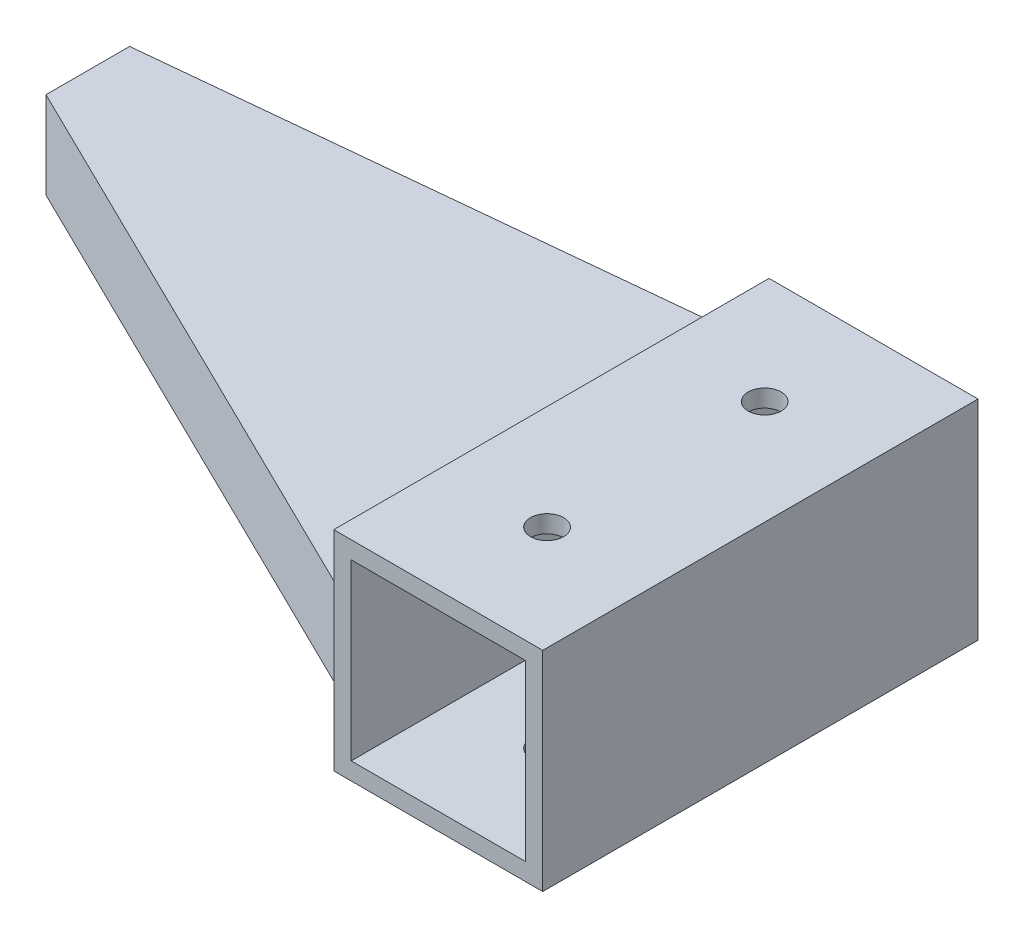
ISO-10303-21;
HEADER;
FILE_DESCRIPTION(('STEP AP214'),'2;1');
FILE_NAME('part.step','',(''),(''),'','','');
FILE_SCHEMA(('AUTOMOTIVE_DESIGN { 1 0 10303 214 1 1 1 1 }'));
ENDSEC;
DATA;
#1=APPLICATION_CONTEXT('core data for automotive mechanical design processes');
#2=APPLICATION_PROTOCOL_DEFINITION('international standard','automotive_design',2000,#1);
#3=PRODUCT_CONTEXT('',#1,'mechanical');
#4=PRODUCT('Part','Part','',(#3));
#5=PRODUCT_RELATED_PRODUCT_CATEGORY('part','',(#4));
#6=PRODUCT_DEFINITION_FORMATION('','',#4);
#7=PRODUCT_DEFINITION_CONTEXT('part definition',#1,'design');
#8=PRODUCT_DEFINITION('design','',#6,#7);
#9=PRODUCT_DEFINITION_SHAPE('','',#8);
#10=(LENGTH_UNIT() NAMED_UNIT(*) SI_UNIT(.MILLI.,.METRE.));
#11=(NAMED_UNIT(*) PLANE_ANGLE_UNIT() SI_UNIT($,.RADIAN.));
#12=(NAMED_UNIT(*) SI_UNIT($,.STERADIAN.) SOLID_ANGLE_UNIT());
#13=UNCERTAINTY_MEASURE_WITH_UNIT(LENGTH_MEASURE(1.E-05),#10,'distance_accuracy_value','');
#14=(GEOMETRIC_REPRESENTATION_CONTEXT(3) GLOBAL_UNCERTAINTY_ASSIGNED_CONTEXT((#13)) GLOBAL_UNIT_ASSIGNED_CONTEXT((#10,
#11,#12)) REPRESENTATION_CONTEXT('',''));
#15=CARTESIAN_POINT('',(0.,0.,0.));
#16=DIRECTION('',(0.,0.,1.));
#17=DIRECTION('',(1.,0.,0.));
#18=AXIS2_PLACEMENT_3D('',#15,#16,#17);
#19=CARTESIAN_POINT('',(-87.376,12.7,20.644));
#20=DIRECTION('',(1.,0.,0.));
#21=DIRECTION('',(0.,0.,-1.));
#22=AXIS2_PLACEMENT_3D('',#19,#20,#21);
#23=PLANE('',#22);
#24=CARTESIAN_POINT('',(-87.376,6.35,14.548));
#25=DIRECTION('',(-1.,0.,0.));
#26=DIRECTION('',(0.,0.,1.));
#27=AXIS2_PLACEMENT_3D('',#24,#25,#26);
#28=CIRCLE('',#27,3.556);
#29=CARTESIAN_POINT('',(-87.376,6.35,18.104));
#30=VERTEX_POINT('',#29);
#31=EDGE_CURVE('E152',#30,#30,#28,.T.);
#32=ORIENTED_EDGE('',*,*,#31,.F.);
#33=EDGE_LOOP('',(#32));
#34=FACE_BOUND('',#33,.T.);
#35=DIRECTION('',(0.,0.,1.));
#36=VECTOR('',#35,1.);
#37=CARTESIAN_POINT('',(-87.376,12.7,20.644));
#38=LINE('',#37,#36);
#39=CARTESIAN_POINT('',(-87.376,12.7,8.452));
#40=VERTEX_POINT('',#39);
#41=CARTESIAN_POINT('',(-87.376,12.7,20.644));
#42=VERTEX_POINT('',#41);
#43=EDGE_CURVE('E49',#40,#42,#38,.T.);
#44=ORIENTED_EDGE('',*,*,#43,.F.);
#45=DIRECTION('',(0.,1.,0.));
#46=VECTOR('',#45,1.);
#47=CARTESIAN_POINT('',(-87.376,-85.2559863000833,8.452));
#48=LINE('',#47,#46);
#49=CARTESIAN_POINT('',(-87.376,0.,8.452));
#50=VERTEX_POINT('',#49);
#51=EDGE_CURVE('E125',#50,#40,#48,.T.);
#52=ORIENTED_EDGE('',*,*,#51,.F.);
#53=DIRECTION('',(0.,0.,1.));
#54=VECTOR('',#53,1.);
#55=CARTESIAN_POINT('',(-87.376,0.,20.644));
#56=LINE('',#55,#54);
#57=CARTESIAN_POINT('',(-87.376,0.,20.644));
#58=VERTEX_POINT('',#57);
#59=EDGE_CURVE('E163',#50,#58,#56,.T.);
#60=ORIENTED_EDGE('',*,*,#59,.T.);
#61=DIRECTION('',(0.,-1.,0.));
#62=VECTOR('',#61,1.);
#63=CARTESIAN_POINT('',(-87.376,12.7,20.644));
#64=LINE('',#63,#62);
#65=EDGE_CURVE('E42',#42,#58,#64,.T.);
#66=ORIENTED_EDGE('',*,*,#65,.F.);
#67=EDGE_LOOP('',(#44,#52,#60,#66));
#68=FACE_BOUND('',#67,.T.);
#69=ADVANCED_FACE('F33',(#34,#68),#23,.F.);
#70=CARTESIAN_POINT('',(0.,12.7,63.5));
#71=DIRECTION('',(0.440361235129621,0.,-0.897820685100936));
#72=DIRECTION('',(-0.897820685100937,0.,-0.440361235129621));
#73=AXIS2_PLACEMENT_3D('',#70,#71,#72);
#74=PLANE('',#73);
#75=DIRECTION('',(0.897820685100936,0.,0.440361235129621));
#76=VECTOR('',#75,1.);
#77=CARTESIAN_POINT('',(0.,0.,63.5));
#78=LINE('',#77,#76);
#79=CARTESIAN_POINT('',(-2.54,0.,62.2541860465116));
#80=VERTEX_POINT('',#79);
#81=EDGE_CURVE('E166',#58,#80,#78,.T.);
#82=ORIENTED_EDGE('',*,*,#81,.T.);
#83=DIRECTION('',(0.,1.,0.));
#84=VECTOR('',#83,1.);
#85=CARTESIAN_POINT('',(-2.54,12.7,62.2541860465116));
#86=LINE('',#85,#84);
#87=CARTESIAN_POINT('',(-2.54,12.7,62.2541860465116));
#88=VERTEX_POINT('',#87);
#89=EDGE_CURVE('E153',#80,#88,#86,.T.);
#90=ORIENTED_EDGE('',*,*,#89,.T.);
#91=DIRECTION('',(0.897820685100936,0.,0.440361235129621));
#92=VECTOR('',#91,1.);
#93=CARTESIAN_POINT('',(0.,12.7,63.5));
#94=LINE('',#93,#92);
#95=EDGE_CURVE('E151',#42,#88,#94,.T.);
#96=ORIENTED_EDGE('',*,*,#95,.F.);
#97=ORIENTED_EDGE('',*,*,#65,.T.);
#98=EDGE_LOOP('',(#82,#90,#96,#97));
#99=FACE_BOUND('',#98,.T.);
#100=ADVANCED_FACE('F263',(#99),#74,.F.);
#101=CARTESIAN_POINT('',(0.,12.7,0.));
#102=DIRECTION('',(-1.,0.,0.));
#103=DIRECTION('',(0.,0.,1.));
#104=AXIS2_PLACEMENT_3D('',#101,#102,#103);
#105=PLANE('',#104);
#106=DIRECTION('',(0.,-1.,0.));
#107=VECTOR('',#106,1.);
#108=CARTESIAN_POINT('',(0.,12.7,63.5));
#109=LINE('',#108,#107);
#110=CARTESIAN_POINT('',(0.,19.05,63.5));
#111=VERTEX_POINT('',#110);
#112=CARTESIAN_POINT('',(0.,-6.35,63.5));
#113=VERTEX_POINT('',#112);
#114=EDGE_CURVE('E173',#111,#113,#109,.T.);
#115=ORIENTED_EDGE('',*,*,#114,.T.);
#116=DIRECTION('',(0.,0.,-1.));
#117=VECTOR('',#116,1.);
#118=CARTESIAN_POINT('',(0.,-6.35,63.5));
#119=LINE('',#118,#117);
#120=CARTESIAN_POINT('',(0.,-6.35,0.));
#121=VERTEX_POINT('',#120);
#122=EDGE_CURVE('E213',#113,#121,#119,.T.);
#123=ORIENTED_EDGE('',*,*,#122,.T.);
#124=DIRECTION('',(0.,-1.,0.));
#125=VECTOR('',#124,1.);
#126=CARTESIAN_POINT('',(0.,12.7,0.));
#127=LINE('',#126,#125);
#128=CARTESIAN_POINT('',(0.,19.05,0.));
#129=VERTEX_POINT('',#128);
#130=EDGE_CURVE('E168',#129,#121,#127,.T.);
#131=ORIENTED_EDGE('',*,*,#130,.F.);
#132=DIRECTION('',(0.,0.,-1.));
#133=VECTOR('',#132,1.);
#134=CARTESIAN_POINT('',(0.,19.05,63.5));
#135=LINE('',#134,#133);
#136=EDGE_CURVE('E205',#111,#129,#135,.T.);
#137=ORIENTED_EDGE('',*,*,#136,.F.);
#138=EDGE_LOOP('',(#115,#123,#131,#137));
#139=FACE_BOUND('',#138,.T.);
#140=ADVANCED_FACE('F302',(#139),#105,.F.);
#141=CARTESIAN_POINT('',(-87.376,12.7,0.));
#142=DIRECTION('',(0.,0.,1.));
#143=DIRECTION('',(1.,0.,0.));
#144=AXIS2_PLACEMENT_3D('',#141,#142,#143);
#145=PLANE('',#144);
#146=DIRECTION('',(0.,1.,0.));
#147=VECTOR('',#146,1.);
#148=CARTESIAN_POINT('',(-2.54,21.59,0.));
#149=LINE('',#148,#147);
#150=CARTESIAN_POINT('',(-2.54,-8.89,0.));
#151=VERTEX_POINT('',#150);
#152=CARTESIAN_POINT('',(-2.54,0.,0.));
#153=VERTEX_POINT('',#152);
#154=EDGE_CURVE('E139',#151,#153,#149,.T.);
#155=ORIENTED_EDGE('',*,*,#154,.T.);
#156=DIRECTION('',(0.,1.,0.));
#157=VECTOR('',#156,1.);
#158=CARTESIAN_POINT('',(-2.54,-85.2559863000833,0.));
#159=LINE('',#158,#157);
#160=CARTESIAN_POINT('',(-2.54,12.7,0.));
#161=VERTEX_POINT('',#160);
#162=EDGE_CURVE('E122',#153,#161,#159,.T.);
#163=ORIENTED_EDGE('',*,*,#162,.T.);
#164=CARTESIAN_POINT('',(-2.54,21.59,0.));
#165=VERTEX_POINT('',#164);
#166=EDGE_CURVE('E135',#161,#165,#149,.T.);
#167=ORIENTED_EDGE('',*,*,#166,.T.);
#168=DIRECTION('',(1.,0.,0.));
#169=VECTOR('',#168,1.);
#170=CARTESIAN_POINT('',(-2.54,21.59,0.));
#171=LINE('',#170,#169);
#172=CARTESIAN_POINT('',(27.94,21.59,0.));
#173=VERTEX_POINT('',#172);
#174=EDGE_CURVE('E227',#165,#173,#171,.T.);
#175=ORIENTED_EDGE('',*,*,#174,.T.);
#176=DIRECTION('',(0.,-1.,0.));
#177=VECTOR('',#176,1.);
#178=CARTESIAN_POINT('',(27.94,21.59,0.));
#179=LINE('',#178,#177);
#180=CARTESIAN_POINT('',(27.94,-8.89,0.));
#181=VERTEX_POINT('',#180);
#182=EDGE_CURVE('E216',#173,#181,#179,.T.);
#183=ORIENTED_EDGE('',*,*,#182,.T.);
#184=DIRECTION('',(-1.,0.,0.));
#185=VECTOR('',#184,1.);
#186=CARTESIAN_POINT('',(-2.54,-8.89,0.));
#187=LINE('',#186,#185);
#188=EDGE_CURVE('E148',#181,#151,#187,.T.);
#189=ORIENTED_EDGE('',*,*,#188,.T.);
#190=EDGE_LOOP('',(#155,#163,#167,#175,#183,#189));
#191=FACE_BOUND('',#190,.T.);
#192=DIRECTION('',(1.,0.,0.));
#193=VECTOR('',#192,1.);
#194=CARTESIAN_POINT('',(0.,19.05,0.));
#195=LINE('',#194,#193);
#196=CARTESIAN_POINT('',(25.4,19.05,0.));
#197=VERTEX_POINT('',#196);
#198=EDGE_CURVE('E183',#129,#197,#195,.T.);
#199=ORIENTED_EDGE('',*,*,#198,.F.);
#200=ORIENTED_EDGE('',*,*,#130,.T.);
#201=DIRECTION('',(-1.,0.,0.));
#202=VECTOR('',#201,1.);
#203=CARTESIAN_POINT('',(0.,-6.35,0.));
#204=LINE('',#203,#202);
#205=CARTESIAN_POINT('',(25.4,-6.35,0.));
#206=VERTEX_POINT('',#205);
#207=EDGE_CURVE('E199',#206,#121,#204,.T.);
#208=ORIENTED_EDGE('',*,*,#207,.F.);
#209=DIRECTION('',(0.,-1.,0.));
#210=VECTOR('',#209,1.);
#211=CARTESIAN_POINT('',(25.4,-6.35,0.));
#212=LINE('',#211,#210);
#213=EDGE_CURVE('E208',#197,#206,#212,.T.);
#214=ORIENTED_EDGE('',*,*,#213,.F.);
#215=EDGE_LOOP('',(#199,#200,#208,#214));
#216=FACE_BOUND('',#215,.T.);
#217=ADVANCED_FACE('F132',(#191,#216),#145,.F.);
#218=CARTESIAN_POINT('',(0.,12.7,0.));
#219=DIRECTION('',(0.,-1.,0.));
#220=DIRECTION('',(0.,0.,-1.));
#221=AXIS2_PLACEMENT_3D('',#218,#219,#220);
#222=PLANE('',#221);
#223=DIRECTION('',(0.,0.,-1.));
#224=VECTOR('',#223,1.);
#225=CARTESIAN_POINT('',(-2.54,12.7,0.));
#226=LINE('',#225,#224);
#227=EDGE_CURVE('E143',#88,#161,#226,.T.);
#228=ORIENTED_EDGE('',*,*,#227,.T.);
#229=DIRECTION('',(0.995073820404762,0.,-0.0991367335808035));
#230=VECTOR('',#229,1.);
#231=CARTESIAN_POINT('',(-87.376,12.7,8.452));
#232=LINE('',#231,#230);
#233=EDGE_CURVE('E119',#40,#161,#232,.T.);
#234=ORIENTED_EDGE('',*,*,#233,.F.);
#235=ORIENTED_EDGE('',*,*,#43,.T.);
#236=ORIENTED_EDGE('',*,*,#95,.T.);
#237=EDGE_LOOP('',(#228,#234,#235,#236));
#238=FACE_BOUND('',#237,.T.);
#239=ADVANCED_FACE('F150',(#238),#222,.F.);
#240=CARTESIAN_POINT('',(0.,0.,0.));
#241=DIRECTION('',(0.,-1.,0.));
#242=DIRECTION('',(0.,0.,-1.));
#243=AXIS2_PLACEMENT_3D('',#240,#241,#242);
#244=PLANE('',#243);
#245=DIRECTION('',(0.995073820404762,0.,-0.0991367335808035));
#246=VECTOR('',#245,1.);
#247=CARTESIAN_POINT('',(-87.376,0.,8.452));
#248=LINE('',#247,#246);
#249=EDGE_CURVE('E127',#50,#153,#248,.T.);
#250=ORIENTED_EDGE('',*,*,#249,.T.);
#251=DIRECTION('',(0.,0.,-1.));
#252=VECTOR('',#251,1.);
#253=CARTESIAN_POINT('',(-2.54,0.,0.));
#254=LINE('',#253,#252);
#255=EDGE_CURVE('E11',#80,#153,#254,.T.);
#256=ORIENTED_EDGE('',*,*,#255,.F.);
#257=ORIENTED_EDGE('',*,*,#81,.F.);
#258=ORIENTED_EDGE('',*,*,#59,.F.);
#259=EDGE_LOOP('',(#250,#256,#257,#258));
#260=FACE_BOUND('',#259,.T.);
#261=ADVANCED_FACE('F260',(#260),#244,.T.);
#262=CARTESIAN_POINT('',(-84.3788,6.35,14.548));
#263=DIRECTION('',(-1.,0.,0.));
#264=DIRECTION('',(0.,0.,1.));
#265=AXIS2_PLACEMENT_3D('',#262,#263,#264);
#266=CYLINDRICAL_SURFACE('',#265,3.556);
#267=CARTESIAN_POINT('',(-84.3788,6.35,14.548));
#268=DIRECTION('',(-1.,0.,0.));
#269=DIRECTION('',(0.,0.,1.));
#270=AXIS2_PLACEMENT_3D('',#267,#268,#269);
#271=CIRCLE('',#270,3.556);
#272=CARTESIAN_POINT('',(-84.3788,6.35,18.104));
#273=VERTEX_POINT('',#272);
#274=EDGE_CURVE('E156',#273,#273,#271,.T.);
#275=CARTESIAN_POINT('',(-84.3788,6.35,18.104));
#276=CARTESIAN_POINT('',(-84.4100208333333,6.35,18.104));
#277=CARTESIAN_POINT('',(-84.4412416666667,6.35,18.104));
#278=CARTESIAN_POINT('',(-84.5036833333333,6.35,18.104));
#279=CARTESIAN_POINT('',(-84.5349041666666,6.35,18.104));
#280=CARTESIAN_POINT('',(-84.5973458333333,6.35,18.104));
#281=CARTESIAN_POINT('',(-84.6285666666667,6.35,18.104));
#282=CARTESIAN_POINT('',(-84.6910083333333,6.35,18.104));
#283=CARTESIAN_POINT('',(-84.7222291666667,6.35,18.104));
#284=CARTESIAN_POINT('',(-84.7846708333333,6.35,18.104));
#285=CARTESIAN_POINT('',(-84.8158916666667,6.35,18.104));
#286=CARTESIAN_POINT('',(-84.8783333333333,6.35,18.104));
#287=CARTESIAN_POINT('',(-84.9095541666667,6.35,18.104));
#288=CARTESIAN_POINT('',(-84.9719958333333,6.35,18.104));
#289=CARTESIAN_POINT('',(-85.0032166666667,6.35,18.104));
#290=CARTESIAN_POINT('',(-85.0656583333333,6.35,18.104));
#291=CARTESIAN_POINT('',(-85.0968791666667,6.35,18.104));
#292=CARTESIAN_POINT('',(-85.1593208333333,6.35,18.104));
#293=CARTESIAN_POINT('',(-85.1905416666666,6.35,18.104));
#294=CARTESIAN_POINT('',(-85.2529833333333,6.35,18.104));
#295=CARTESIAN_POINT('',(-85.2842041666667,6.35,18.104));
#296=CARTESIAN_POINT('',(-85.3466458333333,6.35,18.104));
#297=CARTESIAN_POINT('',(-85.3778666666666,6.35,18.104));
#298=CARTESIAN_POINT('',(-85.4403083333333,6.35,18.104));
#299=CARTESIAN_POINT('',(-85.4715291666667,6.35,18.104));
#300=CARTESIAN_POINT('',(-85.5339708333333,6.35,18.104));
#301=CARTESIAN_POINT('',(-85.5651916666666,6.35,18.104));
#302=CARTESIAN_POINT('',(-85.6276333333333,6.35,18.104));
#303=CARTESIAN_POINT('',(-85.6588541666667,6.35,18.104));
#304=CARTESIAN_POINT('',(-85.7212958333333,6.35,18.104));
#305=CARTESIAN_POINT('',(-85.7525166666667,6.35,18.104));
#306=CARTESIAN_POINT('',(-85.8149583333333,6.35,18.104));
#307=CARTESIAN_POINT('',(-85.8461791666667,6.35,18.104));
#308=CARTESIAN_POINT('',(-85.9086208333333,6.35,18.104));
#309=CARTESIAN_POINT('',(-85.9398416666667,6.35,18.104));
#310=CARTESIAN_POINT('',(-86.0022833333333,6.35,18.104));
#311=CARTESIAN_POINT('',(-86.0335041666666,6.35,18.104));
#312=CARTESIAN_POINT('',(-86.0959458333333,6.35,18.104));
#313=CARTESIAN_POINT('',(-86.1271666666667,6.35,18.104));
#314=CARTESIAN_POINT('',(-86.1896083333333,6.35,18.104));
#315=CARTESIAN_POINT('',(-86.2208291666666,6.35,18.104));
#316=CARTESIAN_POINT('',(-86.2832708333333,6.35,18.104));
#317=CARTESIAN_POINT('',(-86.3144916666667,6.35,18.104));
#318=CARTESIAN_POINT('',(-86.3769333333333,6.35,18.104));
#319=CARTESIAN_POINT('',(-86.4081541666666,6.35,18.104));
#320=CARTESIAN_POINT('',(-86.4705958333333,6.35,18.104));
#321=CARTESIAN_POINT('',(-86.5018166666667,6.35,18.104));
#322=CARTESIAN_POINT('',(-86.5642583333333,6.35,18.104));
#323=CARTESIAN_POINT('',(-86.5954791666666,6.35,18.104));
#324=CARTESIAN_POINT('',(-86.6579208333333,6.35,18.104));
#325=CARTESIAN_POINT('',(-86.6891416666666,6.35,18.104));
#326=CARTESIAN_POINT('',(-86.7515833333333,6.35,18.104));
#327=CARTESIAN_POINT('',(-86.7828041666667,6.35,18.104));
#328=CARTESIAN_POINT('',(-86.8452458333333,6.35,18.104));
#329=CARTESIAN_POINT('',(-86.8764666666667,6.35,18.104));
#330=CARTESIAN_POINT('',(-86.9389083333333,6.35,18.104));
#331=CARTESIAN_POINT('',(-86.9701291666667,6.35,18.104));
#332=CARTESIAN_POINT('',(-87.0325708333333,6.35,18.104));
#333=CARTESIAN_POINT('',(-87.0637916666667,6.35,18.104));
#334=CARTESIAN_POINT('',(-87.1262333333333,6.35,18.104));
#335=CARTESIAN_POINT('',(-87.1574541666667,6.35,18.104));
#336=CARTESIAN_POINT('',(-87.2198958333333,6.35,18.104));
#337=CARTESIAN_POINT('',(-87.2511166666667,6.35,18.104));
#338=CARTESIAN_POINT('',(-87.3135583333333,6.35,18.104));
#339=CARTESIAN_POINT('',(-87.3447791666667,6.35,18.104));
#340=CARTESIAN_POINT('',(-87.376,6.35,18.104));
#341=B_SPLINE_CURVE_WITH_KNOTS('',3,(#275,#276,#277,#278,#279,#280,#281,#282,#283,#284,#285,
#286,#287,#288,#289,#290,#291,#292,#293,#294,#295,#296,#297,#298,#299,#300,#301,#302,#303,#304,
#305,#306,#307,#308,#309,#310,#311,#312,#313,#314,#315,#316,#317,#318,#319,#320,#321,#322,#323,
#324,#325,#326,#327,#328,#329,#330,#331,#332,#333,#334,#335,#336,#337,#338,#339,#340),
.UNSPECIFIED.,.F.,.F.,(4,2,2,2,2,2,2,2,2,2,2,2,2,2,2,2,2,2,2,2,2,2,2,2,2,2,2,2,2,2,2,2,4),(0.,
0.093662500000008,0.187325000000002,0.28098750000001,0.374650000000004,0.468312500000012,
0.561975000000006,0.655637500000014,0.749300000000008,0.842962500000002,0.93662500000001,
1.0302875,1.12395000000001,1.21761250000001,1.31127500000001,1.40493750000001,1.49860000000002,
1.59226250000001,1.685925,1.77958750000001,1.87325000000001,1.96691250000001,2.06057500000001,
2.15423750000002,2.24790000000001,2.34156250000001,2.43522500000001,2.52888750000001,
2.62255000000002,2.71621250000001,2.80987500000002,2.90353750000001,2.99720000000002),.UNSPECIFIED.);
#342=EDGE_CURVE('BSEAM305',#273,#30,#341,.T.);
#343=ORIENTED_EDGE('',*,*,#274,.F.);
#344=ORIENTED_EDGE('',*,*,#31,.T.);
#345=ORIENTED_EDGE('',*,*,#342,.T.);
#346=ORIENTED_EDGE('',*,*,#342,.F.);
#347=EDGE_LOOP('',(#343,#345,#344,#346));
#348=FACE_BOUND('',#347,.T.);
#349=ADVANCED_FACE('F305',(#348),#266,.F.);
#350=CARTESIAN_POINT('',(-84.3788,6.35,14.548));
#351=DIRECTION('',(-1.,0.,0.));
#352=DIRECTION('',(0.,0.,1.));
#353=AXIS2_PLACEMENT_3D('',#350,#351,#352);
#354=PLANE('',#353);
#355=ORIENTED_EDGE('',*,*,#274,.T.);
#356=EDGE_LOOP('',(#355));
#357=FACE_BOUND('',#356,.T.);
#358=ADVANCED_FACE('F307',(#357),#354,.T.);
#359=CARTESIAN_POINT('',(-2.54,21.59,63.5));
#360=DIRECTION('',(-1.,0.,0.));
#361=DIRECTION('',(0.,0.,1.));
#362=AXIS2_PLACEMENT_3D('',#359,#360,#361);
#363=PLANE('',#362);
#364=ORIENTED_EDGE('',*,*,#227,.F.);
#365=ORIENTED_EDGE('',*,*,#89,.F.);
#366=ORIENTED_EDGE('',*,*,#255,.T.);
#367=ORIENTED_EDGE('',*,*,#154,.F.);
#368=DIRECTION('',(0.,0.,-1.));
#369=VECTOR('',#368,1.);
#370=CARTESIAN_POINT('',(-2.54,-8.89,63.5));
#371=LINE('',#370,#369);
#372=CARTESIAN_POINT('',(-2.54,-8.89,63.5));
#373=VERTEX_POINT('',#372);
#374=EDGE_CURVE('E242',#373,#151,#371,.T.);
#375=ORIENTED_EDGE('',*,*,#374,.F.);
#376=DIRECTION('',(0.,1.,0.));
#377=VECTOR('',#376,1.);
#378=CARTESIAN_POINT('',(-2.54,21.59,63.5));
#379=LINE('',#378,#377);
#380=CARTESIAN_POINT('',(-2.54,21.59,63.5));
#381=VERTEX_POINT('',#380);
#382=EDGE_CURVE('E230',#373,#381,#379,.T.);
#383=ORIENTED_EDGE('',*,*,#382,.T.);
#384=DIRECTION('',(0.,0.,-1.));
#385=VECTOR('',#384,1.);
#386=CARTESIAN_POINT('',(-2.54,21.59,63.5));
#387=LINE('',#386,#385);
#388=EDGE_CURVE('E146',#381,#165,#387,.T.);
#389=ORIENTED_EDGE('',*,*,#388,.T.);
#390=ORIENTED_EDGE('',*,*,#166,.F.);
#391=EDGE_LOOP('',(#364,#365,#366,#367,#375,#383,#389,#390));
#392=FACE_BOUND('',#391,.T.);
#393=ADVANCED_FACE('F142',(#392),#363,.T.);
#394=CARTESIAN_POINT('',(27.94,21.59,63.5));
#395=DIRECTION('',(1.,0.,0.));
#396=DIRECTION('',(0.,0.,-1.));
#397=AXIS2_PLACEMENT_3D('',#394,#395,#396);
#398=PLANE('',#397);
#399=ORIENTED_EDGE('',*,*,#182,.F.);
#400=DIRECTION('',(0.,0.,-1.));
#401=VECTOR('',#400,1.);
#402=CARTESIAN_POINT('',(27.94,21.59,63.5));
#403=LINE('',#402,#401);
#404=CARTESIAN_POINT('',(27.94,21.59,63.5));
#405=VERTEX_POINT('',#404);
#406=EDGE_CURVE('E158',#405,#173,#403,.T.);
#407=ORIENTED_EDGE('',*,*,#406,.F.);
#408=DIRECTION('',(0.,-1.,0.));
#409=VECTOR('',#408,1.);
#410=CARTESIAN_POINT('',(27.94,21.59,63.5));
#411=LINE('',#410,#409);
#412=CARTESIAN_POINT('',(27.94,-8.89,63.5));
#413=VERTEX_POINT('',#412);
#414=EDGE_CURVE('E223',#405,#413,#411,.T.);
#415=ORIENTED_EDGE('',*,*,#414,.T.);
#416=DIRECTION('',(0.,0.,-1.));
#417=VECTOR('',#416,1.);
#418=CARTESIAN_POINT('',(27.94,-8.89,63.5));
#419=LINE('',#418,#417);
#420=EDGE_CURVE('E235',#413,#181,#419,.T.);
#421=ORIENTED_EDGE('',*,*,#420,.T.);
#422=EDGE_LOOP('',(#399,#407,#415,#421));
#423=FACE_BOUND('',#422,.T.);
#424=ADVANCED_FACE('F246',(#423),#398,.T.);
#425=CARTESIAN_POINT('',(-2.54,21.59,63.5));
#426=DIRECTION('',(0.,1.,0.));
#427=DIRECTION('',(0.,0.,1.));
#428=AXIS2_PLACEMENT_3D('',#425,#426,#427);
#429=PLANE('',#428);
#430=CARTESIAN_POINT('',(12.7,21.59,47.625));
#431=DIRECTION('',(0.,1.,0.));
#432=DIRECTION('',(0.,0.,1.));
#433=AXIS2_PLACEMENT_3D('',#430,#431,#432);
#434=CIRCLE('',#433,2.413);
#435=CARTESIAN_POINT('',(12.7,21.59,50.038));
#436=VERTEX_POINT('',#435);
#437=EDGE_CURVE('E266',#436,#436,#434,.T.);
#438=ORIENTED_EDGE('',*,*,#437,.F.);
#439=EDGE_LOOP('',(#438));
#440=FACE_BOUND('',#439,.T.);
#441=CARTESIAN_POINT('',(12.7,21.59,15.875));
#442=DIRECTION('',(0.,1.,0.));
#443=DIRECTION('',(0.,0.,1.));
#444=AXIS2_PLACEMENT_3D('',#441,#442,#443);
#445=CIRCLE('',#444,2.413);
#446=CARTESIAN_POINT('',(12.7,21.59,18.288));
#447=VERTEX_POINT('',#446);
#448=EDGE_CURVE('E186',#447,#447,#445,.T.);
#449=ORIENTED_EDGE('',*,*,#448,.F.);
#450=EDGE_LOOP('',(#449));
#451=FACE_BOUND('',#450,.T.);
#452=ORIENTED_EDGE('',*,*,#174,.F.);
#453=ORIENTED_EDGE('',*,*,#388,.F.);
#454=DIRECTION('',(1.,0.,0.));
#455=VECTOR('',#454,1.);
#456=CARTESIAN_POINT('',(-2.54,21.59,63.5));
#457=LINE('',#456,#455);
#458=EDGE_CURVE('E232',#381,#405,#457,.T.);
#459=ORIENTED_EDGE('',*,*,#458,.T.);
#460=ORIENTED_EDGE('',*,*,#406,.T.);
#461=EDGE_LOOP('',(#452,#453,#459,#460));
#462=FACE_BOUND('',#461,.T.);
#463=ADVANCED_FACE('F252',(#440,#451,#462),#429,.T.);
#464=CARTESIAN_POINT('',(-2.54,-8.89,63.5));
#465=DIRECTION('',(0.,-1.,0.));
#466=DIRECTION('',(0.,0.,-1.));
#467=AXIS2_PLACEMENT_3D('',#464,#465,#466);
#468=PLANE('',#467);
#469=CARTESIAN_POINT('',(12.7,-8.89,47.625));
#470=DIRECTION('',(0.,-1.,0.));
#471=DIRECTION('',(0.,0.,-1.));
#472=AXIS2_PLACEMENT_3D('',#469,#470,#471);
#473=CIRCLE('',#472,2.413);
#474=CARTESIAN_POINT('',(12.7,-8.89,45.212));
#475=VERTEX_POINT('',#474);
#476=EDGE_CURVE('E269',#475,#475,#473,.F.);
#477=ORIENTED_EDGE('',*,*,#476,.T.);
#478=EDGE_LOOP('',(#477));
#479=FACE_BOUND('',#478,.T.);
#480=CARTESIAN_POINT('',(12.7,-8.89,15.875));
#481=DIRECTION('',(0.,-1.,0.));
#482=DIRECTION('',(0.,0.,-1.));
#483=AXIS2_PLACEMENT_3D('',#480,#481,#482);
#484=CIRCLE('',#483,2.413);
#485=CARTESIAN_POINT('',(12.7,-8.89,13.462));
#486=VERTEX_POINT('',#485);
#487=EDGE_CURVE('E179',#486,#486,#484,.F.);
#488=ORIENTED_EDGE('',*,*,#487,.T.);
#489=EDGE_LOOP('',(#488));
#490=FACE_BOUND('',#489,.T.);
#491=ORIENTED_EDGE('',*,*,#188,.F.);
#492=ORIENTED_EDGE('',*,*,#420,.F.);
#493=DIRECTION('',(-1.,0.,0.));
#494=VECTOR('',#493,1.);
#495=CARTESIAN_POINT('',(-2.54,-8.89,63.5));
#496=LINE('',#495,#494);
#497=EDGE_CURVE('E226',#413,#373,#496,.T.);
#498=ORIENTED_EDGE('',*,*,#497,.T.);
#499=ORIENTED_EDGE('',*,*,#374,.T.);
#500=EDGE_LOOP('',(#491,#492,#498,#499));
#501=FACE_BOUND('',#500,.T.);
#502=ADVANCED_FACE('F250',(#479,#490,#501),#468,.T.);
#503=CARTESIAN_POINT('',(0.,0.,63.5));
#504=DIRECTION('',(0.,0.,1.));
#505=DIRECTION('',(1.,0.,0.));
#506=AXIS2_PLACEMENT_3D('',#503,#504,#505);
#507=PLANE('',#506);
#508=DIRECTION('',(-1.,0.,0.));
#509=VECTOR('',#508,1.);
#510=CARTESIAN_POINT('',(0.,-6.35,63.5));
#511=LINE('',#510,#509);
#512=CARTESIAN_POINT('',(25.4,-6.35,63.5));
#513=VERTEX_POINT('',#512);
#514=EDGE_CURVE('E202',#513,#113,#511,.T.);
#515=ORIENTED_EDGE('',*,*,#514,.T.);
#516=ORIENTED_EDGE('',*,*,#114,.F.);
#517=DIRECTION('',(1.,0.,0.));
#518=VECTOR('',#517,1.);
#519=CARTESIAN_POINT('',(0.,19.05,63.5));
#520=LINE('',#519,#518);
#521=CARTESIAN_POINT('',(25.4,19.05,63.5));
#522=VERTEX_POINT('',#521);
#523=EDGE_CURVE('E195',#111,#522,#520,.T.);
#524=ORIENTED_EDGE('',*,*,#523,.T.);
#525=DIRECTION('',(0.,-1.,0.));
#526=VECTOR('',#525,1.);
#527=CARTESIAN_POINT('',(25.4,-6.35,63.5));
#528=LINE('',#527,#526);
#529=EDGE_CURVE('E198',#522,#513,#528,.T.);
#530=ORIENTED_EDGE('',*,*,#529,.T.);
#531=EDGE_LOOP('',(#515,#516,#524,#530));
#532=FACE_BOUND('',#531,.T.);
#533=ORIENTED_EDGE('',*,*,#414,.F.);
#534=ORIENTED_EDGE('',*,*,#458,.F.);
#535=ORIENTED_EDGE('',*,*,#382,.F.);
#536=ORIENTED_EDGE('',*,*,#497,.F.);
#537=EDGE_LOOP('',(#533,#534,#535,#536));
#538=FACE_BOUND('',#537,.T.);
#539=ADVANCED_FACE('F255',(#532,#538),#507,.T.);
#540=CARTESIAN_POINT('',(0.,-6.35,63.5));
#541=DIRECTION('',(0.,-1.,0.));
#542=DIRECTION('',(1.,0.,0.));
#543=AXIS2_PLACEMENT_3D('',#540,#541,#542);
#544=PLANE('',#543);
#545=CARTESIAN_POINT('',(12.7,-6.35,47.625));
#546=DIRECTION('',(0.,-1.,0.));
#547=DIRECTION('',(1.,0.,0.));
#548=AXIS2_PLACEMENT_3D('',#545,#546,#547);
#549=CIRCLE('',#548,2.413);
#550=CARTESIAN_POINT('',(15.113,-6.35,47.625));
#551=VERTEX_POINT('',#550);
#552=EDGE_CURVE('E191',#551,#551,#549,.T.);
#553=ORIENTED_EDGE('',*,*,#552,.T.);
#554=EDGE_LOOP('',(#553));
#555=FACE_BOUND('',#554,.T.);
#556=CARTESIAN_POINT('',(12.7,-6.35,15.875));
#557=DIRECTION('',(0.,-1.,0.));
#558=DIRECTION('',(1.,0.,0.));
#559=AXIS2_PLACEMENT_3D('',#556,#557,#558);
#560=CIRCLE('',#559,2.413);
#561=CARTESIAN_POINT('',(15.113,-6.35,15.875));
#562=VERTEX_POINT('',#561);
#563=EDGE_CURVE('E178',#562,#562,#560,.T.);
#564=ORIENTED_EDGE('',*,*,#563,.T.);
#565=EDGE_LOOP('',(#564));
#566=FACE_BOUND('',#565,.T.);
#567=ORIENTED_EDGE('',*,*,#207,.T.);
#568=ORIENTED_EDGE('',*,*,#122,.F.);
#569=ORIENTED_EDGE('',*,*,#514,.F.);
#570=DIRECTION('',(0.,0.,-1.));
#571=VECTOR('',#570,1.);
#572=CARTESIAN_POINT('',(25.4,-6.35,63.5));
#573=LINE('',#572,#571);
#574=EDGE_CURVE('E217',#513,#206,#573,.T.);
#575=ORIENTED_EDGE('',*,*,#574,.T.);
#576=EDGE_LOOP('',(#567,#568,#569,#575));
#577=FACE_BOUND('',#576,.T.);
#578=ADVANCED_FACE('F334',(#555,#566,#577),#544,.F.);
#579=CARTESIAN_POINT('',(25.4,-6.35,63.5));
#580=DIRECTION('',(1.,0.,0.));
#581=DIRECTION('',(0.,0.,-1.));
#582=AXIS2_PLACEMENT_3D('',#579,#580,#581);
#583=PLANE('',#582);
#584=ORIENTED_EDGE('',*,*,#213,.T.);
#585=ORIENTED_EDGE('',*,*,#574,.F.);
#586=ORIENTED_EDGE('',*,*,#529,.F.);
#587=DIRECTION('',(0.,0.,-1.));
#588=VECTOR('',#587,1.);
#589=CARTESIAN_POINT('',(25.4,19.05,63.5));
#590=LINE('',#589,#588);
#591=EDGE_CURVE('E219',#522,#197,#590,.T.);
#592=ORIENTED_EDGE('',*,*,#591,.T.);
#593=EDGE_LOOP('',(#584,#585,#586,#592));
#594=FACE_BOUND('',#593,.T.);
#595=ADVANCED_FACE('F338',(#594),#583,.F.);
#596=CARTESIAN_POINT('',(0.,19.05,63.5));
#597=DIRECTION('',(0.,1.,0.));
#598=DIRECTION('',(-1.,0.,0.));
#599=AXIS2_PLACEMENT_3D('',#596,#597,#598);
#600=PLANE('',#599);
#601=CARTESIAN_POINT('',(12.7,19.05,47.625));
#602=DIRECTION('',(0.,1.,0.));
#603=DIRECTION('',(-1.,0.,0.));
#604=AXIS2_PLACEMENT_3D('',#601,#602,#603);
#605=CIRCLE('',#604,2.413);
#606=CARTESIAN_POINT('',(10.287,19.05,47.625));
#607=VERTEX_POINT('',#606);
#608=EDGE_CURVE('E36',#607,#607,#605,.T.);
#609=ORIENTED_EDGE('',*,*,#608,.T.);
#610=EDGE_LOOP('',(#609));
#611=FACE_BOUND('',#610,.T.);
#612=CARTESIAN_POINT('',(12.7,19.05,15.875));
#613=DIRECTION('',(0.,1.,0.));
#614=DIRECTION('',(-1.,0.,0.));
#615=AXIS2_PLACEMENT_3D('',#612,#613,#614);
#616=CIRCLE('',#615,2.413);
#617=CARTESIAN_POINT('',(10.287,19.05,15.875));
#618=VERTEX_POINT('',#617);
#619=EDGE_CURVE('E176',#618,#618,#616,.T.);
#620=ORIENTED_EDGE('',*,*,#619,.T.);
#621=EDGE_LOOP('',(#620));
#622=FACE_BOUND('',#621,.T.);
#623=ORIENTED_EDGE('',*,*,#198,.T.);
#624=ORIENTED_EDGE('',*,*,#591,.F.);
#625=ORIENTED_EDGE('',*,*,#523,.F.);
#626=ORIENTED_EDGE('',*,*,#136,.T.);
#627=EDGE_LOOP('',(#623,#624,#625,#626));
#628=FACE_BOUND('',#627,.T.);
#629=ADVANCED_FACE('F280',(#611,#622,#628),#600,.F.);
#630=CARTESIAN_POINT('',(12.7,-15.7149946520126,15.875));
#631=DIRECTION('',(0.,1.,0.));
#632=DIRECTION('',(0.,0.,1.));
#633=AXIS2_PLACEMENT_3D('',#630,#631,#632);
#634=CYLINDRICAL_SURFACE('',#633,2.413);
#635=ORIENTED_EDGE('',*,*,#448,.T.);
#636=EDGE_LOOP('',(#635));
#637=FACE_BOUND('',#636,.T.);
#638=ORIENTED_EDGE('',*,*,#619,.F.);
#639=EDGE_LOOP('',(#638));
#640=FACE_BOUND('',#639,.T.);
#641=ADVANCED_FACE('F293',(#637,#640),#634,.F.);
#642=ORIENTED_EDGE('',*,*,#487,.F.);
#643=EDGE_LOOP('',(#642));
#644=FACE_BOUND('',#643,.T.);
#645=ORIENTED_EDGE('',*,*,#563,.F.);
#646=EDGE_LOOP('',(#645));
#647=FACE_BOUND('',#646,.T.);
#648=ADVANCED_FACE('F285',(#644,#647),#634,.F.);
#649=CARTESIAN_POINT('',(12.7,-15.7149946520126,47.625));
#650=DIRECTION('',(0.,1.,0.));
#651=DIRECTION('',(0.,0.,1.));
#652=AXIS2_PLACEMENT_3D('',#649,#650,#651);
#653=CYLINDRICAL_SURFACE('',#652,2.413);
#654=ORIENTED_EDGE('',*,*,#437,.T.);
#655=EDGE_LOOP('',(#654));
#656=FACE_BOUND('',#655,.T.);
#657=ORIENTED_EDGE('',*,*,#608,.F.);
#658=EDGE_LOOP('',(#657));
#659=FACE_BOUND('',#658,.T.);
#660=ADVANCED_FACE('F282',(#656,#659),#653,.F.);
#661=ORIENTED_EDGE('',*,*,#476,.F.);
#662=EDGE_LOOP('',(#661));
#663=FACE_BOUND('',#662,.T.);
#664=ORIENTED_EDGE('',*,*,#552,.F.);
#665=EDGE_LOOP('',(#664));
#666=FACE_BOUND('',#665,.T.);
#667=ADVANCED_FACE('F284',(#663,#666),#653,.F.);
#668=CARTESIAN_POINT('',(-87.376,-85.2559863000833,8.452));
#669=DIRECTION('',(0.0991367335808035,0.,0.995073820404762));
#670=DIRECTION('',(0.995073820404762,0.,-0.0991367335808035));
#671=AXIS2_PLACEMENT_3D('',#668,#669,#670);
#672=PLANE('',#671);
#673=ORIENTED_EDGE('',*,*,#51,.T.);
#674=ORIENTED_EDGE('',*,*,#233,.T.);
#675=ORIENTED_EDGE('',*,*,#162,.F.);
#676=ORIENTED_EDGE('',*,*,#249,.F.);
#677=EDGE_LOOP('',(#673,#674,#675,#676));
#678=FACE_BOUND('',#677,.T.);
#679=ADVANCED_FACE('F121',(#678),#672,.F.);
#680=CLOSED_SHELL('',(#69,#100,#140,#217,#239,#261,#349,#358,#393,#424,#463,#502,#539,#578,#595,
#629,#641,#648,#660,#667,#679));
#681=MANIFOLD_SOLID_BREP('B2',#680);
#682=ADVANCED_BREP_SHAPE_REPRESENTATION('',(#18,#681),#14);
#683=SHAPE_DEFINITION_REPRESENTATION(#9,#682);
ENDSEC;
END-ISO-10303-21;
